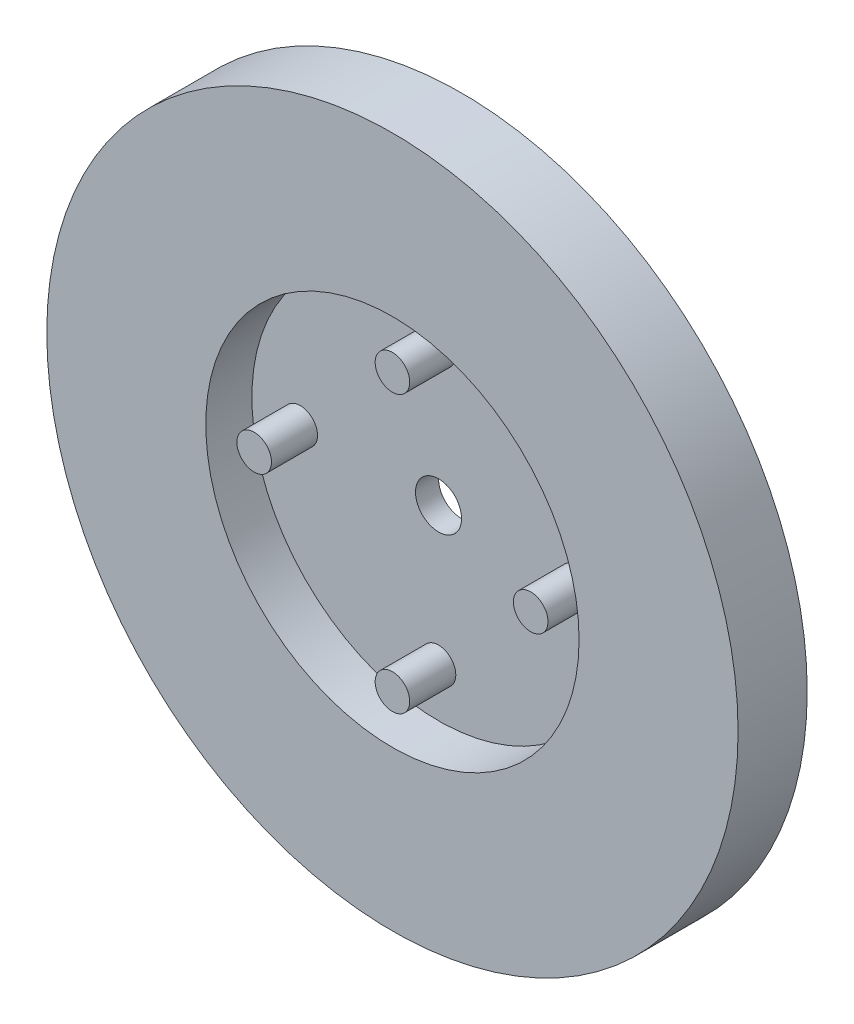
ISO-10303-21;
HEADER;
FILE_DESCRIPTION(('STEP AP214'),'2;1');
FILE_NAME('part.step','',(''),(''),'','','');
FILE_SCHEMA(('AUTOMOTIVE_DESIGN { 1 0 10303 214 1 1 1 1 }'));
ENDSEC;
DATA;
#1=APPLICATION_CONTEXT('core data for automotive mechanical design processes');
#2=APPLICATION_PROTOCOL_DEFINITION('international standard','automotive_design',2000,#1);
#3=PRODUCT_CONTEXT('',#1,'mechanical');
#4=PRODUCT('Part','Part','',(#3));
#5=PRODUCT_RELATED_PRODUCT_CATEGORY('part','',(#4));
#6=PRODUCT_DEFINITION_FORMATION('','',#4);
#7=PRODUCT_DEFINITION_CONTEXT('part definition',#1,'design');
#8=PRODUCT_DEFINITION('design','',#6,#7);
#9=PRODUCT_DEFINITION_SHAPE('','',#8);
#10=(LENGTH_UNIT() NAMED_UNIT(*) SI_UNIT(.MILLI.,.METRE.));
#11=(NAMED_UNIT(*) PLANE_ANGLE_UNIT() SI_UNIT($,.RADIAN.));
#12=(NAMED_UNIT(*) SI_UNIT($,.STERADIAN.) SOLID_ANGLE_UNIT());
#13=UNCERTAINTY_MEASURE_WITH_UNIT(LENGTH_MEASURE(1.E-05),#10,'distance_accuracy_value','');
#14=(GEOMETRIC_REPRESENTATION_CONTEXT(3) GLOBAL_UNCERTAINTY_ASSIGNED_CONTEXT((#13)) GLOBAL_UNIT_ASSIGNED_CONTEXT((#10,
#11,#12)) REPRESENTATION_CONTEXT('',''));
#15=CARTESIAN_POINT('',(0.,0.,0.));
#16=DIRECTION('',(0.,0.,1.));
#17=DIRECTION('',(1.,0.,0.));
#18=AXIS2_PLACEMENT_3D('',#15,#16,#17);
#19=CARTESIAN_POINT('',(0.,0.,1.));
#20=DIRECTION('',(0.,0.,-1.));
#21=DIRECTION('',(-1.,0.,0.));
#22=AXIS2_PLACEMENT_3D('',#19,#20,#21);
#23=CYLINDRICAL_SURFACE('',#22,1.);
#24=CARTESIAN_POINT('',(0.,0.,1.));
#25=DIRECTION('',(0.,0.,1.));
#26=DIRECTION('',(1.,0.,0.));
#27=AXIS2_PLACEMENT_3D('',#24,#25,#26);
#28=CIRCLE('',#27,1.);
#29=CARTESIAN_POINT('',(1.,0.,1.));
#30=VERTEX_POINT('',#29);
#31=EDGE_CURVE('E11',#30,#30,#28,.T.);
#32=ORIENTED_EDGE('',*,*,#31,.T.);
#33=EDGE_LOOP('',(#32));
#34=FACE_BOUND('',#33,.T.);
#35=CARTESIAN_POINT('',(0.,0.,0.));
#36=DIRECTION('',(0.,0.,1.));
#37=DIRECTION('',(1.,0.,0.));
#38=AXIS2_PLACEMENT_3D('',#35,#36,#37);
#39=CIRCLE('',#38,1.);
#40=CARTESIAN_POINT('',(1.,0.,0.));
#41=VERTEX_POINT('',#40);
#42=EDGE_CURVE('E64',#41,#41,#39,.T.);
#43=ORIENTED_EDGE('',*,*,#42,.F.);
#44=EDGE_LOOP('',(#43));
#45=FACE_BOUND('',#44,.T.);
#46=ADVANCED_FACE('F61',(#34,#45),#23,.F.);
#47=CARTESIAN_POINT('',(0.,0.,1.));
#48=DIRECTION('',(0.,0.,1.));
#49=DIRECTION('',(1.,0.,0.));
#50=AXIS2_PLACEMENT_3D('',#47,#48,#49);
#51=PLANE('',#50);
#52=CARTESIAN_POINT('',(3.38856148926383E-13,-6.,1.));
#53=DIRECTION('',(0.,0.,1.));
#54=DIRECTION('',(1.,0.,0.));
#55=AXIS2_PLACEMENT_3D('',#52,#53,#54);
#56=CIRCLE('',#55,0.750000000000364);
#57=CARTESIAN_POINT('',(0.750000000000703,-6.,1.));
#58=VERTEX_POINT('',#57);
#59=EDGE_CURVE('E102',#58,#58,#56,.F.);
#60=ORIENTED_EDGE('',*,*,#59,.T.);
#61=EDGE_LOOP('',(#60));
#62=FACE_BOUND('',#61,.T.);
#63=CARTESIAN_POINT('',(6.00000000000017,1.69428074463191E-13,1.));
#64=DIRECTION('',(0.,0.,1.));
#65=DIRECTION('',(1.,0.,0.));
#66=AXIS2_PLACEMENT_3D('',#63,#64,#65);
#67=CIRCLE('',#66,0.750000000000132);
#68=CARTESIAN_POINT('',(6.7500000000003,1.69428074463191E-13,1.));
#69=VERTEX_POINT('',#68);
#70=EDGE_CURVE('E96',#69,#69,#67,.F.);
#71=ORIENTED_EDGE('',*,*,#70,.T.);
#72=EDGE_LOOP('',(#71));
#73=FACE_BOUND('',#72,.T.);
#74=CARTESIAN_POINT('',(0.,6.,1.));
#75=DIRECTION('',(0.,0.,1.));
#76=DIRECTION('',(1.,0.,0.));
#77=AXIS2_PLACEMENT_3D('',#74,#75,#76);
#78=CIRCLE('',#77,0.75);
#79=CARTESIAN_POINT('',(0.75,6.,1.));
#80=VERTEX_POINT('',#79);
#81=EDGE_CURVE('E90',#80,#80,#78,.F.);
#82=ORIENTED_EDGE('',*,*,#81,.T.);
#83=EDGE_LOOP('',(#82));
#84=FACE_BOUND('',#83,.T.);
#85=CARTESIAN_POINT('',(-5.99999999999983,-1.7016286254268E-13,1.));
#86=DIRECTION('',(0.,0.,1.));
#87=DIRECTION('',(1.,0.,0.));
#88=AXIS2_PLACEMENT_3D('',#85,#86,#87);
#89=CIRCLE('',#88,0.750000000000272);
#90=CARTESIAN_POINT('',(-5.24999999999956,-1.7016286254268E-13,1.));
#91=VERTEX_POINT('',#90);
#92=EDGE_CURVE('E80',#91,#91,#89,.F.);
#93=ORIENTED_EDGE('',*,*,#92,.T.);
#94=EDGE_LOOP('',(#93));
#95=FACE_BOUND('',#94,.T.);
#96=ORIENTED_EDGE('',*,*,#31,.F.);
#97=EDGE_LOOP('',(#96));
#98=FACE_BOUND('',#97,.T.);
#99=CARTESIAN_POINT('',(0.,0.,1.));
#100=DIRECTION('',(0.,0.,1.));
#101=DIRECTION('',(1.,0.,0.));
#102=AXIS2_PLACEMENT_3D('',#99,#100,#101);
#103=CIRCLE('',#102,8.1);
#104=CARTESIAN_POINT('',(8.1,0.,1.));
#105=VERTEX_POINT('',#104);
#106=EDGE_CURVE('E71',#105,#105,#103,.F.);
#107=ORIENTED_EDGE('',*,*,#106,.F.);
#108=EDGE_LOOP('',(#107));
#109=FACE_BOUND('',#108,.T.);
#110=ADVANCED_FACE('F126',(#62,#73,#84,#95,#98,#109),#51,.T.);
#111=CARTESIAN_POINT('',(0.,0.,0.));
#112=DIRECTION('',(0.,0.,1.));
#113=DIRECTION('',(1.,0.,0.));
#114=AXIS2_PLACEMENT_3D('',#111,#112,#113);
#115=PLANE('',#114);
#116=ORIENTED_EDGE('',*,*,#42,.T.);
#117=EDGE_LOOP('',(#116));
#118=FACE_BOUND('',#117,.T.);
#119=CARTESIAN_POINT('',(0.,0.,0.));
#120=DIRECTION('',(0.,0.,1.));
#121=DIRECTION('',(1.,0.,0.));
#122=AXIS2_PLACEMENT_3D('',#119,#120,#121);
#123=CIRCLE('',#122,15.);
#124=CARTESIAN_POINT('',(15.,0.,0.));
#125=VERTEX_POINT('',#124);
#126=EDGE_CURVE('E76',#125,#125,#123,.T.);
#127=ORIENTED_EDGE('',*,*,#126,.F.);
#128=EDGE_LOOP('',(#127));
#129=FACE_BOUND('',#128,.T.);
#130=ADVANCED_FACE('F130',(#118,#129),#115,.F.);
#131=CARTESIAN_POINT('',(0.,0.,3.));
#132=DIRECTION('',(0.,0.,-1.));
#133=DIRECTION('',(-1.,0.,0.));
#134=AXIS2_PLACEMENT_3D('',#131,#132,#133);
#135=CYLINDRICAL_SURFACE('',#134,8.1);
#136=ORIENTED_EDGE('',*,*,#106,.T.);
#137=EDGE_LOOP('',(#136));
#138=FACE_BOUND('',#137,.T.);
#139=CARTESIAN_POINT('',(0.,0.,3.));
#140=DIRECTION('',(0.,0.,1.));
#141=DIRECTION('',(1.,0.,0.));
#142=AXIS2_PLACEMENT_3D('',#139,#140,#141);
#143=CIRCLE('',#142,8.1);
#144=CARTESIAN_POINT('',(8.1,0.,3.));
#145=VERTEX_POINT('',#144);
#146=EDGE_CURVE('E79',#145,#145,#143,.T.);
#147=ORIENTED_EDGE('',*,*,#146,.T.);
#148=EDGE_LOOP('',(#147));
#149=FACE_BOUND('',#148,.T.);
#150=ADVANCED_FACE('F138',(#138,#149),#135,.F.);
#151=CARTESIAN_POINT('',(0.,0.,3.));
#152=DIRECTION('',(0.,0.,-1.));
#153=DIRECTION('',(-1.,0.,0.));
#154=AXIS2_PLACEMENT_3D('',#151,#152,#153);
#155=CYLINDRICAL_SURFACE('',#154,15.);
#156=CARTESIAN_POINT('',(0.,0.,3.));
#157=DIRECTION('',(0.,0.,1.));
#158=DIRECTION('',(1.,0.,0.));
#159=AXIS2_PLACEMENT_3D('',#156,#157,#158);
#160=CIRCLE('',#159,15.);
#161=CARTESIAN_POINT('',(15.,0.,3.));
#162=VERTEX_POINT('',#161);
#163=EDGE_CURVE('E75',#162,#162,#160,.T.);
#164=ORIENTED_EDGE('',*,*,#163,.F.);
#165=EDGE_LOOP('',(#164));
#166=FACE_BOUND('',#165,.T.);
#167=ORIENTED_EDGE('',*,*,#126,.T.);
#168=EDGE_LOOP('',(#167));
#169=FACE_BOUND('',#168,.T.);
#170=ADVANCED_FACE('F141',(#166,#169),#155,.T.);
#171=CARTESIAN_POINT('',(0.,0.,3.));
#172=DIRECTION('',(0.,0.,1.));
#173=DIRECTION('',(1.,0.,0.));
#174=AXIS2_PLACEMENT_3D('',#171,#172,#173);
#175=PLANE('',#174);
#176=ORIENTED_EDGE('',*,*,#146,.F.);
#177=EDGE_LOOP('',(#176));
#178=FACE_BOUND('',#177,.T.);
#179=ORIENTED_EDGE('',*,*,#163,.T.);
#180=EDGE_LOOP('',(#179));
#181=FACE_BOUND('',#180,.T.);
#182=ADVANCED_FACE('F143',(#178,#181),#175,.T.);
#183=CARTESIAN_POINT('',(-5.99999999999983,-1.7016286254268E-13,3.));
#184=DIRECTION('',(0.,0.,-1.));
#185=DIRECTION('',(-1.,0.,0.));
#186=AXIS2_PLACEMENT_3D('',#183,#184,#185);
#187=CYLINDRICAL_SURFACE('',#186,0.750000000000272);
#188=ORIENTED_EDGE('',*,*,#92,.F.);
#189=EDGE_LOOP('',(#188));
#190=FACE_BOUND('',#189,.T.);
#191=CARTESIAN_POINT('',(-5.99999999999983,-1.7016286254268E-13,3.));
#192=DIRECTION('',(0.,0.,1.));
#193=DIRECTION('',(1.,0.,0.));
#194=AXIS2_PLACEMENT_3D('',#191,#192,#193);
#195=CIRCLE('',#194,0.750000000000272);
#196=CARTESIAN_POINT('',(-5.24999999999956,-1.7016286254268E-13,3.));
#197=VERTEX_POINT('',#196);
#198=EDGE_CURVE('E87',#197,#197,#195,.T.);
#199=ORIENTED_EDGE('',*,*,#198,.F.);
#200=EDGE_LOOP('',(#199));
#201=FACE_BOUND('',#200,.T.);
#202=ADVANCED_FACE('F150',(#190,#201),#187,.T.);
#203=CARTESIAN_POINT('',(0.,0.,3.));
#204=DIRECTION('',(0.,0.,1.));
#205=DIRECTION('',(1.,0.,0.));
#206=AXIS2_PLACEMENT_3D('',#203,#204,#205);
#207=PLANE('',#206);
#208=ORIENTED_EDGE('',*,*,#198,.T.);
#209=EDGE_LOOP('',(#208));
#210=FACE_BOUND('',#209,.T.);
#211=ADVANCED_FACE('F157',(#210),#207,.T.);
#212=CARTESIAN_POINT('',(0.,6.,3.));
#213=DIRECTION('',(0.,0.,-1.));
#214=DIRECTION('',(-1.,0.,0.));
#215=AXIS2_PLACEMENT_3D('',#212,#213,#214);
#216=CYLINDRICAL_SURFACE('',#215,0.75);
#217=ORIENTED_EDGE('',*,*,#81,.F.);
#218=EDGE_LOOP('',(#217));
#219=FACE_BOUND('',#218,.T.);
#220=CARTESIAN_POINT('',(0.,6.,3.));
#221=DIRECTION('',(0.,0.,1.));
#222=DIRECTION('',(1.,0.,0.));
#223=AXIS2_PLACEMENT_3D('',#220,#221,#222);
#224=CIRCLE('',#223,0.75);
#225=CARTESIAN_POINT('',(0.75,6.,3.));
#226=VERTEX_POINT('',#225);
#227=EDGE_CURVE('E93',#226,#226,#224,.T.);
#228=ORIENTED_EDGE('',*,*,#227,.F.);
#229=EDGE_LOOP('',(#228));
#230=FACE_BOUND('',#229,.T.);
#231=ADVANCED_FACE('F160',(#219,#230),#216,.T.);
#232=CARTESIAN_POINT('',(0.,0.,3.));
#233=DIRECTION('',(0.,0.,1.));
#234=DIRECTION('',(1.,0.,0.));
#235=AXIS2_PLACEMENT_3D('',#232,#233,#234);
#236=PLANE('',#235);
#237=ORIENTED_EDGE('',*,*,#227,.T.);
#238=EDGE_LOOP('',(#237));
#239=FACE_BOUND('',#238,.T.);
#240=ADVANCED_FACE('F165',(#239),#236,.T.);
#241=CARTESIAN_POINT('',(6.00000000000017,1.69428074463191E-13,3.));
#242=DIRECTION('',(0.,0.,-1.));
#243=DIRECTION('',(-1.,0.,0.));
#244=AXIS2_PLACEMENT_3D('',#241,#242,#243);
#245=CYLINDRICAL_SURFACE('',#244,0.750000000000132);
#246=ORIENTED_EDGE('',*,*,#70,.F.);
#247=EDGE_LOOP('',(#246));
#248=FACE_BOUND('',#247,.T.);
#249=CARTESIAN_POINT('',(6.00000000000017,1.69428074463191E-13,3.));
#250=DIRECTION('',(0.,0.,1.));
#251=DIRECTION('',(1.,0.,0.));
#252=AXIS2_PLACEMENT_3D('',#249,#250,#251);
#253=CIRCLE('',#252,0.750000000000132);
#254=CARTESIAN_POINT('',(6.7500000000003,1.69428074463191E-13,3.));
#255=VERTEX_POINT('',#254);
#256=EDGE_CURVE('E99',#255,#255,#253,.T.);
#257=ORIENTED_EDGE('',*,*,#256,.F.);
#258=EDGE_LOOP('',(#257));
#259=FACE_BOUND('',#258,.T.);
#260=ADVANCED_FACE('F121',(#248,#259),#245,.T.);
#261=CARTESIAN_POINT('',(6.00000000000017,1.69428074463191E-13,3.));
#262=DIRECTION('',(0.,0.,1.));
#263=DIRECTION('',(1.,0.,0.));
#264=AXIS2_PLACEMENT_3D('',#261,#262,#263);
#265=PLANE('',#264);
#266=ORIENTED_EDGE('',*,*,#256,.T.);
#267=EDGE_LOOP('',(#266));
#268=FACE_BOUND('',#267,.T.);
#269=ADVANCED_FACE('F113',(#268),#265,.T.);
#270=CARTESIAN_POINT('',(3.38856148926383E-13,-6.,3.));
#271=DIRECTION('',(0.,0.,-1.));
#272=DIRECTION('',(-1.,0.,0.));
#273=AXIS2_PLACEMENT_3D('',#270,#271,#272);
#274=CYLINDRICAL_SURFACE('',#273,0.750000000000364);
#275=ORIENTED_EDGE('',*,*,#59,.F.);
#276=EDGE_LOOP('',(#275));
#277=FACE_BOUND('',#276,.T.);
#278=CARTESIAN_POINT('',(3.38856148926383E-13,-6.,3.));
#279=DIRECTION('',(0.,0.,1.));
#280=DIRECTION('',(1.,0.,0.));
#281=AXIS2_PLACEMENT_3D('',#278,#279,#280);
#282=CIRCLE('',#281,0.750000000000364);
#283=CARTESIAN_POINT('',(0.750000000000703,-6.,3.));
#284=VERTEX_POINT('',#283);
#285=EDGE_CURVE('E105',#284,#284,#282,.T.);
#286=ORIENTED_EDGE('',*,*,#285,.F.);
#287=EDGE_LOOP('',(#286));
#288=FACE_BOUND('',#287,.T.);
#289=ADVANCED_FACE('F111',(#277,#288),#274,.T.);
#290=CARTESIAN_POINT('',(3.38856148926383E-13,-6.,3.));
#291=DIRECTION('',(0.,0.,1.));
#292=DIRECTION('',(1.,0.,0.));
#293=AXIS2_PLACEMENT_3D('',#290,#291,#292);
#294=PLANE('',#293);
#295=ORIENTED_EDGE('',*,*,#285,.T.);
#296=EDGE_LOOP('',(#295));
#297=FACE_BOUND('',#296,.T.);
#298=ADVANCED_FACE('F109',(#297),#294,.T.);
#299=CLOSED_SHELL('',(#46,#110,#130,#150,#170,#182,#202,#211,#231,#240,#260,#269,#289,#298));
#300=MANIFOLD_SOLID_BREP('B2',#299);
#301=ADVANCED_BREP_SHAPE_REPRESENTATION('',(#18,#300),#14);
#302=SHAPE_DEFINITION_REPRESENTATION(#9,#301);
ENDSEC;
END-ISO-10303-21;
